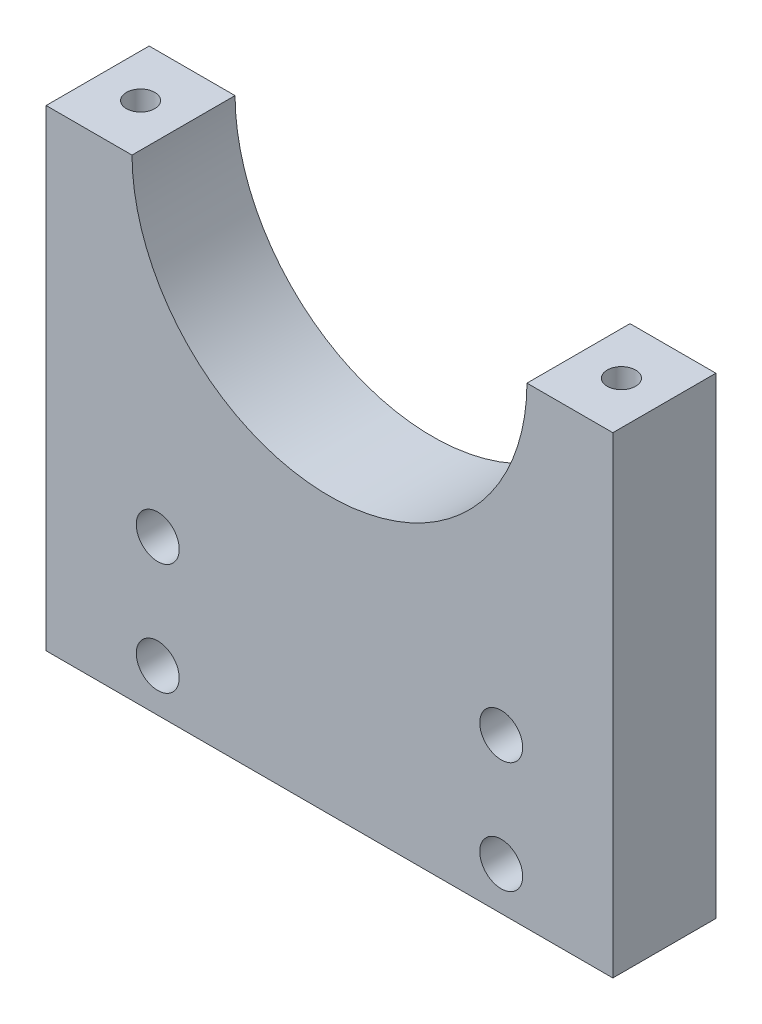
ISO-10303-21;
HEADER;
FILE_DESCRIPTION(('STEP AP214'),'2;1');
FILE_NAME('part.step','',(''),(''),'','','');
FILE_SCHEMA(('AUTOMOTIVE_DESIGN { 1 0 10303 214 1 1 1 1 }'));
ENDSEC;
DATA;
#1=APPLICATION_CONTEXT('core data for automotive mechanical design processes');
#2=APPLICATION_PROTOCOL_DEFINITION('international standard','automotive_design',2000,#1);
#3=PRODUCT_CONTEXT('',#1,'mechanical');
#4=PRODUCT('Part','Part','',(#3));
#5=PRODUCT_RELATED_PRODUCT_CATEGORY('part','',(#4));
#6=PRODUCT_DEFINITION_FORMATION('','',#4);
#7=PRODUCT_DEFINITION_CONTEXT('part definition',#1,'design');
#8=PRODUCT_DEFINITION('design','',#6,#7);
#9=PRODUCT_DEFINITION_SHAPE('','',#8);
#10=(LENGTH_UNIT() NAMED_UNIT(*) SI_UNIT(.MILLI.,.METRE.));
#11=(NAMED_UNIT(*) PLANE_ANGLE_UNIT() SI_UNIT($,.RADIAN.));
#12=(NAMED_UNIT(*) SI_UNIT($,.STERADIAN.) SOLID_ANGLE_UNIT());
#13=UNCERTAINTY_MEASURE_WITH_UNIT(LENGTH_MEASURE(1.E-05),#10,'distance_accuracy_value','');
#14=(GEOMETRIC_REPRESENTATION_CONTEXT(3) GLOBAL_UNCERTAINTY_ASSIGNED_CONTEXT((#13)) GLOBAL_UNIT_ASSIGNED_CONTEXT((#10,
#11,#12)) REPRESENTATION_CONTEXT('',''));
#15=CARTESIAN_POINT('',(0.,0.,0.));
#16=DIRECTION('',(0.,0.,1.));
#17=DIRECTION('',(1.,0.,0.));
#18=AXIS2_PLACEMENT_3D('',#15,#16,#17);
#19=CARTESIAN_POINT('',(0.,55.,12.));
#20=DIRECTION('',(0.,-1.,0.));
#21=DIRECTION('',(0.,0.,-1.));
#22=AXIS2_PLACEMENT_3D('',#19,#20,#21);
#23=PLANE('',#22);
#24=CARTESIAN_POINT('',(61.,55.,5.99999999999999));
#25=DIRECTION('',(0.,1.,0.));
#26=DIRECTION('',(0.,0.,1.));
#27=AXIS2_PLACEMENT_3D('',#24,#25,#26);
#28=CIRCLE('',#27,1.64999999999999);
#29=CARTESIAN_POINT('',(61.,55.,7.64999999999998));
#30=VERTEX_POINT('',#29);
#31=EDGE_CURVE('E112',#30,#30,#28,.T.);
#32=ORIENTED_EDGE('',*,*,#31,.F.);
#33=EDGE_LOOP('',(#32));
#34=FACE_BOUND('',#33,.T.);
#35=DIRECTION('',(-1.,0.,0.));
#36=VECTOR('',#35,1.);
#37=CARTESIAN_POINT('',(0.,55.,0.));
#38=LINE('',#37,#36);
#39=CARTESIAN_POINT('',(66.,55.,0.));
#40=VERTEX_POINT('',#39);
#41=CARTESIAN_POINT('',(55.9997826076683,55.,0.));
#42=VERTEX_POINT('',#41);
#43=EDGE_CURVE('E157',#40,#42,#38,.T.);
#44=ORIENTED_EDGE('',*,*,#43,.T.);
#45=DIRECTION('',(0.,0.,1.));
#46=VECTOR('',#45,1.);
#47=CARTESIAN_POINT('',(55.9997826076683,55.,0.));
#48=LINE('',#47,#46);
#49=CARTESIAN_POINT('',(55.9997826076683,55.,12.));
#50=VERTEX_POINT('',#49);
#51=EDGE_CURVE('E50',#42,#50,#48,.T.);
#52=ORIENTED_EDGE('',*,*,#51,.T.);
#53=DIRECTION('',(-1.,0.,0.));
#54=VECTOR('',#53,1.);
#55=CARTESIAN_POINT('',(0.,55.,12.));
#56=LINE('',#55,#54);
#57=CARTESIAN_POINT('',(66.,55.,12.));
#58=VERTEX_POINT('',#57);
#59=EDGE_CURVE('E161',#58,#50,#56,.T.);
#60=ORIENTED_EDGE('',*,*,#59,.F.);
#61=DIRECTION('',(0.,0.,-1.));
#62=VECTOR('',#61,1.);
#63=CARTESIAN_POINT('',(66.,55.,12.));
#64=LINE('',#63,#62);
#65=EDGE_CURVE('E174',#58,#40,#64,.T.);
#66=ORIENTED_EDGE('',*,*,#65,.T.);
#67=EDGE_LOOP('',(#44,#52,#60,#66));
#68=FACE_BOUND('',#67,.T.);
#69=ADVANCED_FACE('F35',(#34,#68),#23,.F.);
#70=CARTESIAN_POINT('',(0.,0.,12.));
#71=DIRECTION('',(1.,0.,0.));
#72=DIRECTION('',(0.,0.,-1.));
#73=AXIS2_PLACEMENT_3D('',#70,#71,#72);
#74=PLANE('',#73);
#75=DIRECTION('',(0.,-1.,0.));
#76=VECTOR('',#75,1.);
#77=CARTESIAN_POINT('',(0.,0.,0.));
#78=LINE('',#77,#76);
#79=CARTESIAN_POINT('',(0.,55.,0.));
#80=VERTEX_POINT('',#79);
#81=CARTESIAN_POINT('',(0.,0.,0.));
#82=VERTEX_POINT('',#81);
#83=EDGE_CURVE('E154',#80,#82,#78,.T.);
#84=ORIENTED_EDGE('',*,*,#83,.T.);
#85=DIRECTION('',(0.,0.,-1.));
#86=VECTOR('',#85,1.);
#87=CARTESIAN_POINT('',(0.,0.,12.));
#88=LINE('',#87,#86);
#89=CARTESIAN_POINT('',(0.,0.,12.));
#90=VERTEX_POINT('',#89);
#91=EDGE_CURVE('E11',#90,#82,#88,.T.);
#92=ORIENTED_EDGE('',*,*,#91,.F.);
#93=DIRECTION('',(0.,-1.,0.));
#94=VECTOR('',#93,1.);
#95=CARTESIAN_POINT('',(0.,0.,12.));
#96=LINE('',#95,#94);
#97=CARTESIAN_POINT('',(0.,55.,12.));
#98=VERTEX_POINT('',#97);
#99=EDGE_CURVE('E155',#98,#90,#96,.T.);
#100=ORIENTED_EDGE('',*,*,#99,.F.);
#101=DIRECTION('',(0.,0.,-1.));
#102=VECTOR('',#101,1.);
#103=CARTESIAN_POINT('',(0.,55.,12.));
#104=LINE('',#103,#102);
#105=EDGE_CURVE('E164',#98,#80,#104,.T.);
#106=ORIENTED_EDGE('',*,*,#105,.T.);
#107=EDGE_LOOP('',(#84,#92,#100,#106));
#108=FACE_BOUND('',#107,.T.);
#109=ADVANCED_FACE('F37',(#108),#74,.F.);
#110=CARTESIAN_POINT('',(0.,0.,12.));
#111=DIRECTION('',(0.,1.,0.));
#112=DIRECTION('',(0.,0.,1.));
#113=AXIS2_PLACEMENT_3D('',#110,#111,#112);
#114=PLANE('',#113);
#115=DIRECTION('',(1.,0.,0.));
#116=VECTOR('',#115,1.);
#117=CARTESIAN_POINT('',(0.,0.,0.));
#118=LINE('',#117,#116);
#119=CARTESIAN_POINT('',(66.,0.,0.));
#120=VERTEX_POINT('',#119);
#121=EDGE_CURVE('E167',#82,#120,#118,.T.);
#122=ORIENTED_EDGE('',*,*,#121,.T.);
#123=DIRECTION('',(0.,0.,-1.));
#124=VECTOR('',#123,1.);
#125=CARTESIAN_POINT('',(66.,0.,12.));
#126=LINE('',#125,#124);
#127=CARTESIAN_POINT('',(66.,0.,12.));
#128=VERTEX_POINT('',#127);
#129=EDGE_CURVE('E43',#128,#120,#126,.T.);
#130=ORIENTED_EDGE('',*,*,#129,.F.);
#131=DIRECTION('',(1.,0.,0.));
#132=VECTOR('',#131,1.);
#133=CARTESIAN_POINT('',(0.,0.,12.));
#134=LINE('',#133,#132);
#135=EDGE_CURVE('E88',#90,#128,#134,.T.);
#136=ORIENTED_EDGE('',*,*,#135,.F.);
#137=ORIENTED_EDGE('',*,*,#91,.T.);
#138=EDGE_LOOP('',(#122,#130,#136,#137));
#139=FACE_BOUND('',#138,.T.);
#140=ADVANCED_FACE('F192',(#139),#114,.F.);
#141=CARTESIAN_POINT('',(66.,0.,12.));
#142=DIRECTION('',(-1.,0.,0.));
#143=DIRECTION('',(0.,0.,1.));
#144=AXIS2_PLACEMENT_3D('',#141,#142,#143);
#145=PLANE('',#144);
#146=DIRECTION('',(0.,1.,0.));
#147=VECTOR('',#146,1.);
#148=CARTESIAN_POINT('',(66.,0.,0.));
#149=LINE('',#148,#147);
#150=EDGE_CURVE('E169',#120,#40,#149,.T.);
#151=ORIENTED_EDGE('',*,*,#150,.T.);
#152=ORIENTED_EDGE('',*,*,#65,.F.);
#153=DIRECTION('',(0.,1.,0.));
#154=VECTOR('',#153,1.);
#155=CARTESIAN_POINT('',(66.,0.,12.));
#156=LINE('',#155,#154);
#157=EDGE_CURVE('E159',#128,#58,#156,.T.);
#158=ORIENTED_EDGE('',*,*,#157,.F.);
#159=ORIENTED_EDGE('',*,*,#129,.T.);
#160=EDGE_LOOP('',(#151,#152,#158,#159));
#161=FACE_BOUND('',#160,.T.);
#162=ADVANCED_FACE('F180',(#161),#145,.F.);
#163=CARTESIAN_POINT('',(5.,55.,6.00000000000001));
#164=DIRECTION('',(0.,1.,0.));
#165=DIRECTION('',(0.,0.,1.));
#166=AXIS2_PLACEMENT_3D('',#163,#164,#165);
#167=CIRCLE('',#166,1.65);
#168=CARTESIAN_POINT('',(5.,55.,7.65000000000001));
#169=VERTEX_POINT('',#168);
#170=EDGE_CURVE('E113',#169,#169,#167,.T.);
#171=ORIENTED_EDGE('',*,*,#170,.F.);
#172=EDGE_LOOP('',(#171));
#173=FACE_BOUND('',#172,.T.);
#174=CARTESIAN_POINT('',(10.0002173923317,55.,12.));
#175=VERTEX_POINT('',#174);
#176=EDGE_CURVE('E59',#175,#98,#56,.T.);
#177=ORIENTED_EDGE('',*,*,#176,.F.);
#178=DIRECTION('',(0.,0.,1.));
#179=VECTOR('',#178,1.);
#180=CARTESIAN_POINT('',(10.0002173923317,55.,0.));
#181=LINE('',#180,#179);
#182=CARTESIAN_POINT('',(10.0002173923317,55.,0.));
#183=VERTEX_POINT('',#182);
#184=EDGE_CURVE('E150',#175,#183,#181,.F.);
#185=ORIENTED_EDGE('',*,*,#184,.T.);
#186=EDGE_CURVE('E81',#183,#80,#38,.T.);
#187=ORIENTED_EDGE('',*,*,#186,.T.);
#188=ORIENTED_EDGE('',*,*,#105,.F.);
#189=EDGE_LOOP('',(#177,#185,#187,#188));
#190=FACE_BOUND('',#189,.T.);
#191=ADVANCED_FACE('F198',(#173,#190),#23,.F.);
#192=CARTESIAN_POINT('',(0.,55.,12.));
#193=DIRECTION('',(0.,0.,-1.));
#194=DIRECTION('',(-1.,0.,0.));
#195=AXIS2_PLACEMENT_3D('',#192,#193,#194);
#196=PLANE('',#195);
#197=CARTESIAN_POINT('',(13.,18.,12.));
#198=DIRECTION('',(0.,0.,1.));
#199=DIRECTION('',(1.,0.,0.));
#200=AXIS2_PLACEMENT_3D('',#197,#198,#199);
#201=CIRCLE('',#200,2.49999999999999);
#202=CARTESIAN_POINT('',(15.5,18.,12.));
#203=VERTEX_POINT('',#202);
#204=EDGE_CURVE('E123',#203,#203,#201,.T.);
#205=ORIENTED_EDGE('',*,*,#204,.F.);
#206=EDGE_LOOP('',(#205));
#207=FACE_BOUND('',#206,.T.);
#208=CARTESIAN_POINT('',(53.,18.,12.));
#209=DIRECTION('',(0.,0.,1.));
#210=DIRECTION('',(1.,0.,0.));
#211=AXIS2_PLACEMENT_3D('',#208,#209,#210);
#212=CIRCLE('',#211,2.49999999999999);
#213=CARTESIAN_POINT('',(55.5,18.,12.));
#214=VERTEX_POINT('',#213);
#215=EDGE_CURVE('E129',#214,#214,#212,.T.);
#216=ORIENTED_EDGE('',*,*,#215,.F.);
#217=EDGE_LOOP('',(#216));
#218=FACE_BOUND('',#217,.T.);
#219=CARTESIAN_POINT('',(13.,5.,12.));
#220=DIRECTION('',(0.,0.,1.));
#221=DIRECTION('',(1.,0.,0.));
#222=AXIS2_PLACEMENT_3D('',#219,#220,#221);
#223=CIRCLE('',#222,2.49999999999999);
#224=CARTESIAN_POINT('',(15.5,5.,12.));
#225=VERTEX_POINT('',#224);
#226=EDGE_CURVE('E135',#225,#225,#223,.T.);
#227=ORIENTED_EDGE('',*,*,#226,.F.);
#228=EDGE_LOOP('',(#227));
#229=FACE_BOUND('',#228,.T.);
#230=CARTESIAN_POINT('',(53.,5.,12.));
#231=DIRECTION('',(0.,0.,1.));
#232=DIRECTION('',(1.,0.,0.));
#233=AXIS2_PLACEMENT_3D('',#230,#231,#232);
#234=CIRCLE('',#233,2.49999999999999);
#235=CARTESIAN_POINT('',(55.5,5.,12.));
#236=VERTEX_POINT('',#235);
#237=EDGE_CURVE('E141',#236,#236,#234,.T.);
#238=ORIENTED_EDGE('',*,*,#237,.F.);
#239=EDGE_LOOP('',(#238));
#240=FACE_BOUND('',#239,.T.);
#241=ORIENTED_EDGE('',*,*,#59,.T.);
#242=CARTESIAN_POINT('',(33.,55.1,12.));
#243=DIRECTION('',(0.,0.,1.));
#244=DIRECTION('',(1.,0.,0.));
#245=AXIS2_PLACEMENT_3D('',#242,#243,#244);
#246=CIRCLE('',#245,23.);
#247=EDGE_CURVE('E147',#175,#50,#246,.T.);
#248=ORIENTED_EDGE('',*,*,#247,.F.);
#249=ORIENTED_EDGE('',*,*,#176,.T.);
#250=ORIENTED_EDGE('',*,*,#99,.T.);
#251=ORIENTED_EDGE('',*,*,#135,.T.);
#252=ORIENTED_EDGE('',*,*,#157,.T.);
#253=EDGE_LOOP('',(#241,#248,#249,#250,#251,#252));
#254=FACE_BOUND('',#253,.T.);
#255=ADVANCED_FACE('F188',(#207,#218,#229,#240,#254),#196,.F.);
#256=CARTESIAN_POINT('',(0.,55.,0.));
#257=DIRECTION('',(0.,0.,-1.));
#258=DIRECTION('',(-1.,0.,0.));
#259=AXIS2_PLACEMENT_3D('',#256,#257,#258);
#260=PLANE('',#259);
#261=CARTESIAN_POINT('',(13.,18.,0.));
#262=DIRECTION('',(0.,0.,1.));
#263=DIRECTION('',(1.,0.,0.));
#264=AXIS2_PLACEMENT_3D('',#261,#262,#263);
#265=CIRCLE('',#264,2.5);
#266=CARTESIAN_POINT('',(15.5,18.,0.));
#267=VERTEX_POINT('',#266);
#268=EDGE_CURVE('E126',#267,#267,#265,.T.);
#269=ORIENTED_EDGE('',*,*,#268,.T.);
#270=EDGE_LOOP('',(#269));
#271=FACE_BOUND('',#270,.T.);
#272=CARTESIAN_POINT('',(53.,18.,0.));
#273=DIRECTION('',(0.,0.,1.));
#274=DIRECTION('',(1.,0.,0.));
#275=AXIS2_PLACEMENT_3D('',#272,#273,#274);
#276=CIRCLE('',#275,2.5);
#277=CARTESIAN_POINT('',(55.5,18.,0.));
#278=VERTEX_POINT('',#277);
#279=EDGE_CURVE('E132',#278,#278,#276,.T.);
#280=ORIENTED_EDGE('',*,*,#279,.T.);
#281=EDGE_LOOP('',(#280));
#282=FACE_BOUND('',#281,.T.);
#283=CARTESIAN_POINT('',(13.,5.,0.));
#284=DIRECTION('',(0.,0.,1.));
#285=DIRECTION('',(1.,0.,0.));
#286=AXIS2_PLACEMENT_3D('',#283,#284,#285);
#287=CIRCLE('',#286,2.5);
#288=CARTESIAN_POINT('',(15.5,5.,0.));
#289=VERTEX_POINT('',#288);
#290=EDGE_CURVE('E138',#289,#289,#287,.T.);
#291=ORIENTED_EDGE('',*,*,#290,.T.);
#292=EDGE_LOOP('',(#291));
#293=FACE_BOUND('',#292,.T.);
#294=CARTESIAN_POINT('',(53.,5.,0.));
#295=DIRECTION('',(0.,0.,1.));
#296=DIRECTION('',(1.,0.,0.));
#297=AXIS2_PLACEMENT_3D('',#294,#295,#296);
#298=CIRCLE('',#297,2.5);
#299=CARTESIAN_POINT('',(55.5,5.,0.));
#300=VERTEX_POINT('',#299);
#301=EDGE_CURVE('E144',#300,#300,#298,.T.);
#302=ORIENTED_EDGE('',*,*,#301,.T.);
#303=EDGE_LOOP('',(#302));
#304=FACE_BOUND('',#303,.T.);
#305=CARTESIAN_POINT('',(33.,55.1,0.));
#306=DIRECTION('',(0.,0.,1.));
#307=DIRECTION('',(1.,0.,0.));
#308=AXIS2_PLACEMENT_3D('',#305,#306,#307);
#309=CIRCLE('',#308,23.);
#310=EDGE_CURVE('E148',#183,#42,#309,.T.);
#311=ORIENTED_EDGE('',*,*,#310,.T.);
#312=ORIENTED_EDGE('',*,*,#43,.F.);
#313=ORIENTED_EDGE('',*,*,#150,.F.);
#314=ORIENTED_EDGE('',*,*,#121,.F.);
#315=ORIENTED_EDGE('',*,*,#83,.F.);
#316=ORIENTED_EDGE('',*,*,#186,.F.);
#317=EDGE_LOOP('',(#311,#312,#313,#314,#315,#316));
#318=FACE_BOUND('',#317,.T.);
#319=ADVANCED_FACE('F184',(#271,#282,#293,#304,#318),#260,.T.);
#320=CARTESIAN_POINT('',(33.,55.1,0.));
#321=DIRECTION('',(0.,0.,1.));
#322=DIRECTION('',(1.,0.,0.));
#323=AXIS2_PLACEMENT_3D('',#320,#321,#322);
#324=CYLINDRICAL_SURFACE('',#323,23.);
#325=ORIENTED_EDGE('',*,*,#310,.F.);
#326=ORIENTED_EDGE('',*,*,#184,.F.);
#327=ORIENTED_EDGE('',*,*,#247,.T.);
#328=ORIENTED_EDGE('',*,*,#51,.F.);
#329=EDGE_LOOP('',(#325,#326,#327,#328));
#330=FACE_BOUND('',#329,.T.);
#331=ADVANCED_FACE('F217',(#330),#324,.F.);
#332=CARTESIAN_POINT('',(53.,5.,12.));
#333=DIRECTION('',(0.,0.,1.));
#334=DIRECTION('',(1.,0.,0.));
#335=AXIS2_PLACEMENT_3D('',#332,#333,#334);
#336=CYLINDRICAL_SURFACE('',#335,2.49999999999999);
#337=ORIENTED_EDGE('',*,*,#301,.F.);
#338=EDGE_LOOP('',(#337));
#339=FACE_BOUND('',#338,.T.);
#340=ORIENTED_EDGE('',*,*,#237,.T.);
#341=EDGE_LOOP('',(#340));
#342=FACE_BOUND('',#341,.T.);
#343=ADVANCED_FACE('F219',(#339,#342),#336,.F.);
#344=CARTESIAN_POINT('',(13.,5.,12.));
#345=DIRECTION('',(0.,0.,1.));
#346=DIRECTION('',(1.,0.,0.));
#347=AXIS2_PLACEMENT_3D('',#344,#345,#346);
#348=CYLINDRICAL_SURFACE('',#347,2.49999999999999);
#349=ORIENTED_EDGE('',*,*,#290,.F.);
#350=EDGE_LOOP('',(#349));
#351=FACE_BOUND('',#350,.T.);
#352=ORIENTED_EDGE('',*,*,#226,.T.);
#353=EDGE_LOOP('',(#352));
#354=FACE_BOUND('',#353,.T.);
#355=ADVANCED_FACE('F225',(#351,#354),#348,.F.);
#356=CARTESIAN_POINT('',(53.,18.,12.));
#357=DIRECTION('',(0.,0.,1.));
#358=DIRECTION('',(1.,0.,0.));
#359=AXIS2_PLACEMENT_3D('',#356,#357,#358);
#360=CYLINDRICAL_SURFACE('',#359,2.49999999999999);
#361=ORIENTED_EDGE('',*,*,#279,.F.);
#362=EDGE_LOOP('',(#361));
#363=FACE_BOUND('',#362,.T.);
#364=ORIENTED_EDGE('',*,*,#215,.T.);
#365=EDGE_LOOP('',(#364));
#366=FACE_BOUND('',#365,.T.);
#367=ADVANCED_FACE('F232',(#363,#366),#360,.F.);
#368=CARTESIAN_POINT('',(13.,18.,12.));
#369=DIRECTION('',(0.,0.,1.));
#370=DIRECTION('',(1.,0.,0.));
#371=AXIS2_PLACEMENT_3D('',#368,#369,#370);
#372=CYLINDRICAL_SURFACE('',#371,2.49999999999999);
#373=ORIENTED_EDGE('',*,*,#268,.F.);
#374=EDGE_LOOP('',(#373));
#375=FACE_BOUND('',#374,.T.);
#376=ORIENTED_EDGE('',*,*,#204,.T.);
#377=EDGE_LOOP('',(#376));
#378=FACE_BOUND('',#377,.T.);
#379=ADVANCED_FACE('F236',(#375,#378),#372,.F.);
#380=CARTESIAN_POINT('',(61.,44.9,5.99999999999999));
#381=DIRECTION('',(0.,1.,0.));
#382=DIRECTION('',(0.,0.,1.));
#383=AXIS2_PLACEMENT_3D('',#380,#381,#382);
#384=CONICAL_SURFACE('',#383,1.64999999999999,1.02974425867665);
#385=CARTESIAN_POINT('',(61.,43.9085799786045,5.99999999999999));
#386=VERTEX_POINT('',#385);
#387=VERTEX_LOOP('',#386);
#388=FACE_BOUND('',#387,.T.);
#389=CARTESIAN_POINT('',(61.,44.9,5.99999999999999));
#390=DIRECTION('',(0.,1.,0.));
#391=DIRECTION('',(0.,0.,1.));
#392=AXIS2_PLACEMENT_3D('',#389,#390,#391);
#393=CIRCLE('',#392,1.64999999999999);
#394=CARTESIAN_POINT('',(61.,44.9,7.64999999999998));
#395=VERTEX_POINT('',#394);
#396=EDGE_CURVE('E116',#395,#395,#393,.T.);
#397=ORIENTED_EDGE('',*,*,#396,.T.);
#398=EDGE_LOOP('',(#397));
#399=FACE_BOUND('',#398,.T.);
#400=ADVANCED_FACE('F240',(#388,#399),#384,.F.);
#401=CARTESIAN_POINT('',(61.,55.,5.99999999999999));
#402=DIRECTION('',(0.,1.,0.));
#403=DIRECTION('',(0.,0.,1.));
#404=AXIS2_PLACEMENT_3D('',#401,#402,#403);
#405=CYLINDRICAL_SURFACE('',#404,1.64999999999999);
#406=ORIENTED_EDGE('',*,*,#396,.F.);
#407=EDGE_LOOP('',(#406));
#408=FACE_BOUND('',#407,.T.);
#409=ORIENTED_EDGE('',*,*,#31,.T.);
#410=EDGE_LOOP('',(#409));
#411=FACE_BOUND('',#410,.T.);
#412=ADVANCED_FACE('F106',(#408,#411),#405,.F.);
#413=CARTESIAN_POINT('',(5.,44.9,6.00000000000001));
#414=DIRECTION('',(0.,1.,0.));
#415=DIRECTION('',(0.,0.,1.));
#416=AXIS2_PLACEMENT_3D('',#413,#414,#415);
#417=CONICAL_SURFACE('',#416,1.65,1.02974425867665);
#418=CARTESIAN_POINT('',(4.99999999999999,43.9085799786045,6.00000000000001));
#419=VERTEX_POINT('',#418);
#420=VERTEX_LOOP('',#419);
#421=FACE_BOUND('',#420,.T.);
#422=CARTESIAN_POINT('',(5.,44.9,6.00000000000001));
#423=DIRECTION('',(0.,1.,0.));
#424=DIRECTION('',(0.,0.,1.));
#425=AXIS2_PLACEMENT_3D('',#422,#423,#424);
#426=CIRCLE('',#425,1.65);
#427=CARTESIAN_POINT('',(5.,44.9,7.65000000000001));
#428=VERTEX_POINT('',#427);
#429=EDGE_CURVE('E110',#428,#428,#426,.T.);
#430=ORIENTED_EDGE('',*,*,#429,.T.);
#431=EDGE_LOOP('',(#430));
#432=FACE_BOUND('',#431,.T.);
#433=ADVANCED_FACE('F102',(#421,#432),#417,.F.);
#434=CARTESIAN_POINT('',(5.,55.,6.00000000000001));
#435=DIRECTION('',(0.,1.,0.));
#436=DIRECTION('',(0.,0.,1.));
#437=AXIS2_PLACEMENT_3D('',#434,#435,#436);
#438=CYLINDRICAL_SURFACE('',#437,1.65);
#439=ORIENTED_EDGE('',*,*,#429,.F.);
#440=EDGE_LOOP('',(#439));
#441=FACE_BOUND('',#440,.T.);
#442=ORIENTED_EDGE('',*,*,#170,.T.);
#443=EDGE_LOOP('',(#442));
#444=FACE_BOUND('',#443,.T.);
#445=ADVANCED_FACE('F105',(#441,#444),#438,.F.);
#446=CLOSED_SHELL('',(#69,#109,#140,#162,#191,#255,#319,#331,#343,#355,#367,#379,#400,#412,#433,#445));
#447=MANIFOLD_SOLID_BREP('B2',#446);
#448=ADVANCED_BREP_SHAPE_REPRESENTATION('',(#18,#447),#14);
#449=SHAPE_DEFINITION_REPRESENTATION(#9,#448);
ENDSEC;
END-ISO-10303-21;
